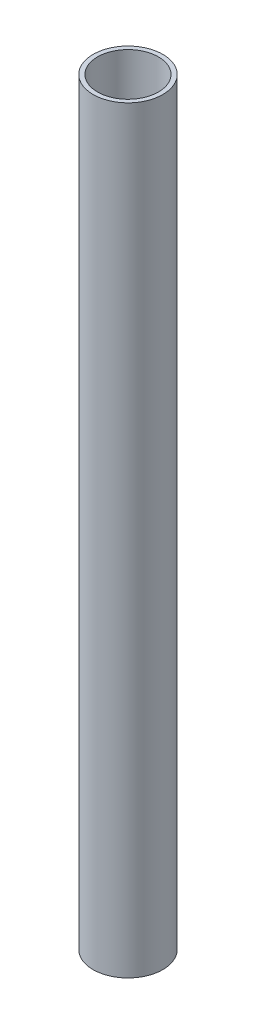
ISO-10303-21;
HEADER;
FILE_DESCRIPTION(('STEP AP214'),'2;1');
FILE_NAME('part.step','',(''),(''),'','','');
FILE_SCHEMA(('AUTOMOTIVE_DESIGN { 1 0 10303 214 1 1 1 1 }'));
ENDSEC;
DATA;
#1=APPLICATION_CONTEXT('core data for automotive mechanical design processes');
#2=APPLICATION_PROTOCOL_DEFINITION('international standard','automotive_design',2000,#1);
#3=PRODUCT_CONTEXT('',#1,'mechanical');
#4=PRODUCT('Part','Part','',(#3));
#5=PRODUCT_RELATED_PRODUCT_CATEGORY('part','',(#4));
#6=PRODUCT_DEFINITION_FORMATION('','',#4);
#7=PRODUCT_DEFINITION_CONTEXT('part definition',#1,'design');
#8=PRODUCT_DEFINITION('design','',#6,#7);
#9=PRODUCT_DEFINITION_SHAPE('','',#8);
#10=(LENGTH_UNIT() NAMED_UNIT(*) SI_UNIT(.MILLI.,.METRE.));
#11=(NAMED_UNIT(*) PLANE_ANGLE_UNIT() SI_UNIT($,.RADIAN.));
#12=(NAMED_UNIT(*) SI_UNIT($,.STERADIAN.) SOLID_ANGLE_UNIT());
#13=UNCERTAINTY_MEASURE_WITH_UNIT(LENGTH_MEASURE(1.E-05),#10,'distance_accuracy_value','');
#14=(GEOMETRIC_REPRESENTATION_CONTEXT(3) GLOBAL_UNCERTAINTY_ASSIGNED_CONTEXT((#13)) GLOBAL_UNIT_ASSIGNED_CONTEXT((#10,
#11,#12)) REPRESENTATION_CONTEXT('',''));
#15=CARTESIAN_POINT('',(0.,0.,0.));
#16=DIRECTION('',(0.,0.,1.));
#17=DIRECTION('',(1.,0.,0.));
#18=AXIS2_PLACEMENT_3D('',#15,#16,#17);
#19=CARTESIAN_POINT('',(0.,174.1,0.));
#20=DIRECTION('',(0.,1.,0.));
#21=DIRECTION('',(0.,0.,1.));
#22=AXIS2_PLACEMENT_3D('',#19,#20,#21);
#23=PLANE('',#22);
#24=CARTESIAN_POINT('',(0.,174.1,0.));
#25=DIRECTION('',(0.,1.,0.));
#26=DIRECTION('',(0.,0.,1.));
#27=AXIS2_PLACEMENT_3D('',#24,#25,#26);
#28=CIRCLE('',#27,8.);
#29=CARTESIAN_POINT('',(0.,174.1,8.));
#30=VERTEX_POINT('',#29);
#31=EDGE_CURVE('E10',#30,#30,#28,.T.);
#32=ORIENTED_EDGE('',*,*,#31,.T.);
#33=EDGE_LOOP('',(#32));
#34=FACE_BOUND('',#33,.T.);
#35=CARTESIAN_POINT('',(0.,174.1,0.));
#36=DIRECTION('',(0.,1.,0.));
#37=DIRECTION('',(0.,0.,1.));
#38=AXIS2_PLACEMENT_3D('',#35,#36,#37);
#39=CIRCLE('',#38,7.);
#40=CARTESIAN_POINT('',(0.,174.1,7.));
#41=VERTEX_POINT('',#40);
#42=EDGE_CURVE('E43',#41,#41,#39,.T.);
#43=ORIENTED_EDGE('',*,*,#42,.F.);
#44=EDGE_LOOP('',(#43));
#45=FACE_BOUND('',#44,.T.);
#46=ADVANCED_FACE('F32',(#34,#45),#23,.T.);
#47=CARTESIAN_POINT('',(0.,0.,0.));
#48=DIRECTION('',(0.,1.,0.));
#49=DIRECTION('',(0.,0.,1.));
#50=AXIS2_PLACEMENT_3D('',#47,#48,#49);
#51=PLANE('',#50);
#52=CARTESIAN_POINT('',(0.,0.,0.));
#53=DIRECTION('',(0.,1.,0.));
#54=DIRECTION('',(0.,0.,1.));
#55=AXIS2_PLACEMENT_3D('',#52,#53,#54);
#56=CIRCLE('',#55,8.);
#57=CARTESIAN_POINT('',(0.,0.,8.));
#58=VERTEX_POINT('',#57);
#59=EDGE_CURVE('E36',#58,#58,#56,.T.);
#60=ORIENTED_EDGE('',*,*,#59,.F.);
#61=EDGE_LOOP('',(#60));
#62=FACE_BOUND('',#61,.T.);
#63=CARTESIAN_POINT('',(0.,0.,0.));
#64=DIRECTION('',(0.,1.,0.));
#65=DIRECTION('',(0.,0.,1.));
#66=AXIS2_PLACEMENT_3D('',#63,#64,#65);
#67=CIRCLE('',#66,7.);
#68=CARTESIAN_POINT('',(0.,0.,7.));
#69=VERTEX_POINT('',#68);
#70=EDGE_CURVE('E45',#69,#69,#67,.T.);
#71=ORIENTED_EDGE('',*,*,#70,.T.);
#72=EDGE_LOOP('',(#71));
#73=FACE_BOUND('',#72,.T.);
#74=ADVANCED_FACE('F55',(#62,#73),#51,.F.);
#75=CARTESIAN_POINT('',(0.,174.1,0.));
#76=DIRECTION('',(0.,-1.,0.));
#77=DIRECTION('',(0.,0.,-1.));
#78=AXIS2_PLACEMENT_3D('',#75,#76,#77);
#79=CYLINDRICAL_SURFACE('',#78,8.);
#80=ORIENTED_EDGE('',*,*,#31,.F.);
#81=EDGE_LOOP('',(#80));
#82=FACE_BOUND('',#81,.T.);
#83=ORIENTED_EDGE('',*,*,#59,.T.);
#84=EDGE_LOOP('',(#83));
#85=FACE_BOUND('',#84,.T.);
#86=ADVANCED_FACE('F34',(#82,#85),#79,.T.);
#87=CARTESIAN_POINT('',(0.,174.1,0.));
#88=DIRECTION('',(0.,-1.,0.));
#89=DIRECTION('',(0.,0.,-1.));
#90=AXIS2_PLACEMENT_3D('',#87,#88,#89);
#91=CYLINDRICAL_SURFACE('',#90,7.);
#92=ORIENTED_EDGE('',*,*,#42,.T.);
#93=EDGE_LOOP('',(#92));
#94=FACE_BOUND('',#93,.T.);
#95=ORIENTED_EDGE('',*,*,#70,.F.);
#96=EDGE_LOOP('',(#95));
#97=FACE_BOUND('',#96,.T.);
#98=ADVANCED_FACE('F51',(#94,#97),#91,.F.);
#99=CLOSED_SHELL('',(#46,#74,#86,#98));
#100=MANIFOLD_SOLID_BREP('B2',#99);
#101=ADVANCED_BREP_SHAPE_REPRESENTATION('',(#18,#100),#14);
#102=SHAPE_DEFINITION_REPRESENTATION(#9,#101);
ENDSEC;
END-ISO-10303-21;
